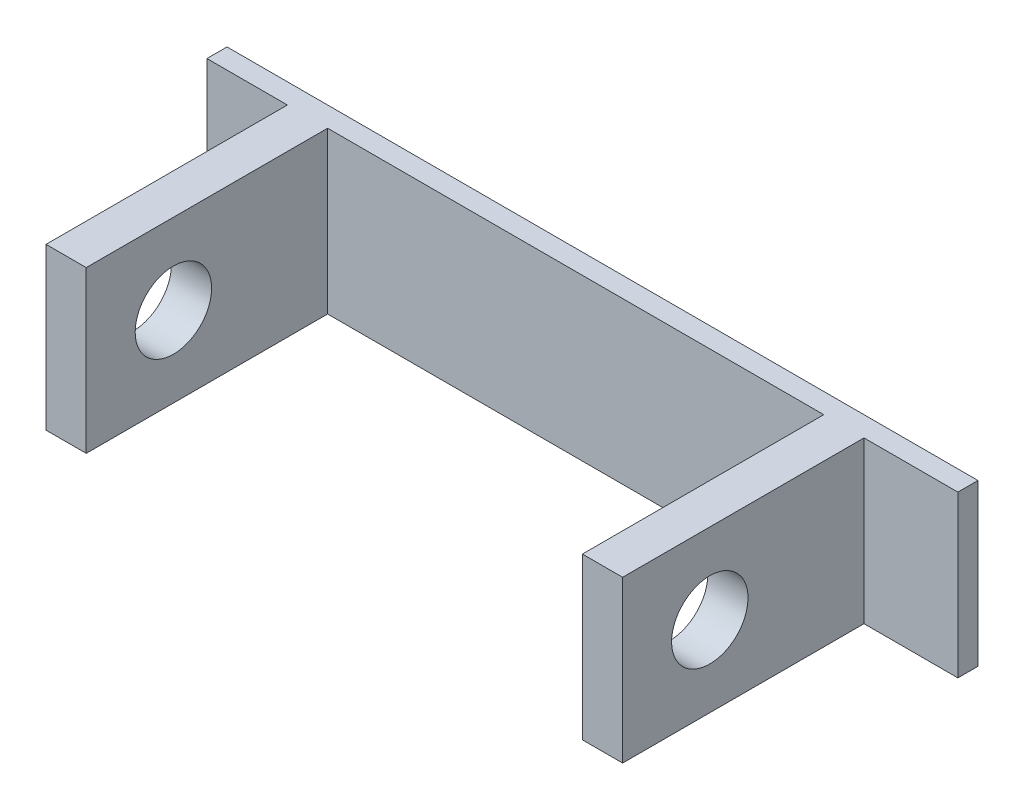
ISO-10303-21;
HEADER;
FILE_DESCRIPTION(('STEP AP214'),'2;1');
FILE_NAME('part.step','',(''),(''),'','','');
FILE_SCHEMA(('AUTOMOTIVE_DESIGN { 1 0 10303 214 1 1 1 1 }'));
ENDSEC;
DATA;
#1=APPLICATION_CONTEXT('core data for automotive mechanical design processes');
#2=APPLICATION_PROTOCOL_DEFINITION('international standard','automotive_design',2000,#1);
#3=PRODUCT_CONTEXT('',#1,'mechanical');
#4=PRODUCT('Part','Part','',(#3));
#5=PRODUCT_RELATED_PRODUCT_CATEGORY('part','',(#4));
#6=PRODUCT_DEFINITION_FORMATION('','',#4);
#7=PRODUCT_DEFINITION_CONTEXT('part definition',#1,'design');
#8=PRODUCT_DEFINITION('design','',#6,#7);
#9=PRODUCT_DEFINITION_SHAPE('','',#8);
#10=(LENGTH_UNIT() NAMED_UNIT(*) SI_UNIT(.MILLI.,.METRE.));
#11=(NAMED_UNIT(*) PLANE_ANGLE_UNIT() SI_UNIT($,.RADIAN.));
#12=(NAMED_UNIT(*) SI_UNIT($,.STERADIAN.) SOLID_ANGLE_UNIT());
#13=UNCERTAINTY_MEASURE_WITH_UNIT(LENGTH_MEASURE(1.E-05),#10,'distance_accuracy_value','');
#14=(GEOMETRIC_REPRESENTATION_CONTEXT(3) GLOBAL_UNCERTAINTY_ASSIGNED_CONTEXT((#13)) GLOBAL_UNIT_ASSIGNED_CONTEXT((#10,
#11,#12)) REPRESENTATION_CONTEXT('',''));
#15=CARTESIAN_POINT('',(0.,0.,0.));
#16=DIRECTION('',(0.,0.,1.));
#17=DIRECTION('',(1.,0.,0.));
#18=AXIS2_PLACEMENT_3D('',#15,#16,#17);
#19=CARTESIAN_POINT('',(0.,0.,1.5));
#20=DIRECTION('',(0.,0.,1.));
#21=DIRECTION('',(1.,0.,0.));
#22=AXIS2_PLACEMENT_3D('',#19,#20,#21);
#23=PLANE('',#22);
#24=DIRECTION('',(1.,0.,0.));
#25=VECTOR('',#24,1.);
#26=CARTESIAN_POINT('',(-28.,-6.,1.5));
#27=LINE('',#26,#25);
#28=CARTESIAN_POINT('',(-19.,-6.,1.5));
#29=VERTEX_POINT('',#28);
#30=CARTESIAN_POINT('',(18.,-6.,1.5));
#31=VERTEX_POINT('',#30);
#32=EDGE_CURVE('E190',#29,#31,#27,.T.);
#33=ORIENTED_EDGE('',*,*,#32,.T.);
#34=DIRECTION('',(0.,-1.,0.));
#35=VECTOR('',#34,1.);
#36=CARTESIAN_POINT('',(18.,6.,1.5));
#37=LINE('',#36,#35);
#38=CARTESIAN_POINT('',(18.,6.,1.5));
#39=VERTEX_POINT('',#38);
#40=EDGE_CURVE('E144',#39,#31,#37,.T.);
#41=ORIENTED_EDGE('',*,*,#40,.F.);
#42=DIRECTION('',(-1.,0.,0.));
#43=VECTOR('',#42,1.);
#44=CARTESIAN_POINT('',(-28.,6.,1.5));
#45=LINE('',#44,#43);
#46=CARTESIAN_POINT('',(-19.,6.,1.5));
#47=VERTEX_POINT('',#46);
#48=EDGE_CURVE('E184',#39,#47,#45,.T.);
#49=ORIENTED_EDGE('',*,*,#48,.T.);
#50=DIRECTION('',(0.,1.,0.));
#51=VECTOR('',#50,1.);
#52=CARTESIAN_POINT('',(-19.,6.,1.5));
#53=LINE('',#52,#51);
#54=EDGE_CURVE('E148',#29,#47,#53,.T.);
#55=ORIENTED_EDGE('',*,*,#54,.F.);
#56=EDGE_LOOP('',(#33,#41,#49,#55));
#57=FACE_BOUND('',#56,.T.);
#58=ADVANCED_FACE('F33',(#57),#23,.T.);
#59=CARTESIAN_POINT('',(28.,6.,1.5));
#60=VERTEX_POINT('',#59);
#61=CARTESIAN_POINT('',(21.,6.,1.5));
#62=VERTEX_POINT('',#61);
#63=EDGE_CURVE('E48',#60,#62,#45,.T.);
#64=ORIENTED_EDGE('',*,*,#63,.T.);
#65=DIRECTION('',(0.,1.,0.));
#66=VECTOR('',#65,1.);
#67=CARTESIAN_POINT('',(21.,6.,1.5));
#68=LINE('',#67,#66);
#69=CARTESIAN_POINT('',(21.,-6.,1.5));
#70=VERTEX_POINT('',#69);
#71=EDGE_CURVE('E52',#70,#62,#68,.T.);
#72=ORIENTED_EDGE('',*,*,#71,.F.);
#73=CARTESIAN_POINT('',(28.,-6.,1.5));
#74=VERTEX_POINT('',#73);
#75=EDGE_CURVE('E186',#70,#74,#27,.T.);
#76=ORIENTED_EDGE('',*,*,#75,.T.);
#77=DIRECTION('',(0.,1.,0.));
#78=VECTOR('',#77,1.);
#79=CARTESIAN_POINT('',(28.,6.,1.5));
#80=LINE('',#79,#78);
#81=EDGE_CURVE('E178',#74,#60,#80,.T.);
#82=ORIENTED_EDGE('',*,*,#81,.T.);
#83=EDGE_LOOP('',(#64,#72,#76,#82));
#84=FACE_BOUND('',#83,.T.);
#85=ADVANCED_FACE('F220',(#84),#23,.T.);
#86=DIRECTION('',(0.,-1.,0.));
#87=VECTOR('',#86,1.);
#88=CARTESIAN_POINT('',(-22.,6.,1.5));
#89=LINE('',#88,#87);
#90=CARTESIAN_POINT('',(-22.,6.,1.5));
#91=VERTEX_POINT('',#90);
#92=CARTESIAN_POINT('',(-22.,-6.,1.5));
#93=VERTEX_POINT('',#92);
#94=EDGE_CURVE('E145',#91,#93,#89,.T.);
#95=ORIENTED_EDGE('',*,*,#94,.F.);
#96=CARTESIAN_POINT('',(-28.,6.,1.5));
#97=VERTEX_POINT('',#96);
#98=EDGE_CURVE('E180',#91,#97,#45,.T.);
#99=ORIENTED_EDGE('',*,*,#98,.T.);
#100=DIRECTION('',(0.,-1.,0.));
#101=VECTOR('',#100,1.);
#102=CARTESIAN_POINT('',(-28.,6.,1.5));
#103=LINE('',#102,#101);
#104=CARTESIAN_POINT('',(-28.,-6.,1.5));
#105=VERTEX_POINT('',#104);
#106=EDGE_CURVE('E183',#97,#105,#103,.T.);
#107=ORIENTED_EDGE('',*,*,#106,.T.);
#108=EDGE_CURVE('E187',#105,#93,#27,.T.);
#109=ORIENTED_EDGE('',*,*,#108,.T.);
#110=EDGE_LOOP('',(#95,#99,#107,#109));
#111=FACE_BOUND('',#110,.T.);
#112=ADVANCED_FACE('F236',(#111),#23,.T.);
#113=CARTESIAN_POINT('',(28.,6.,1.5));
#114=DIRECTION('',(-1.,0.,0.));
#115=DIRECTION('',(0.,-1.,0.));
#116=AXIS2_PLACEMENT_3D('',#113,#114,#115);
#117=PLANE('',#116);
#118=DIRECTION('',(0.,1.,0.));
#119=VECTOR('',#118,1.);
#120=CARTESIAN_POINT('',(28.,6.,0.));
#121=LINE('',#120,#119);
#122=CARTESIAN_POINT('',(28.,-6.,0.));
#123=VERTEX_POINT('',#122);
#124=CARTESIAN_POINT('',(28.,6.,0.));
#125=VERTEX_POINT('',#124);
#126=EDGE_CURVE('E177',#123,#125,#121,.T.);
#127=ORIENTED_EDGE('',*,*,#126,.T.);
#128=DIRECTION('',(0.,0.,-1.));
#129=VECTOR('',#128,1.);
#130=CARTESIAN_POINT('',(28.,6.,1.5));
#131=LINE('',#130,#129);
#132=EDGE_CURVE('E11',#60,#125,#131,.T.);
#133=ORIENTED_EDGE('',*,*,#132,.F.);
#134=ORIENTED_EDGE('',*,*,#81,.F.);
#135=DIRECTION('',(0.,0.,-1.));
#136=VECTOR('',#135,1.);
#137=CARTESIAN_POINT('',(28.,-6.,1.5));
#138=LINE('',#137,#136);
#139=EDGE_CURVE('E189',#74,#123,#138,.T.);
#140=ORIENTED_EDGE('',*,*,#139,.T.);
#141=EDGE_LOOP('',(#127,#133,#134,#140));
#142=FACE_BOUND('',#141,.T.);
#143=ADVANCED_FACE('F35',(#142),#117,.F.);
#144=CARTESIAN_POINT('',(-28.,6.,1.5));
#145=DIRECTION('',(0.,-1.,0.));
#146=DIRECTION('',(0.,0.,-1.));
#147=AXIS2_PLACEMENT_3D('',#144,#145,#146);
#148=PLANE('',#147);
#149=DIRECTION('',(-1.,0.,0.));
#150=VECTOR('',#149,1.);
#151=CARTESIAN_POINT('',(-28.,6.,0.));
#152=LINE('',#151,#150);
#153=CARTESIAN_POINT('',(-28.,6.,0.));
#154=VERTEX_POINT('',#153);
#155=EDGE_CURVE('E193',#125,#154,#152,.T.);
#156=ORIENTED_EDGE('',*,*,#155,.T.);
#157=DIRECTION('',(0.,0.,-1.));
#158=VECTOR('',#157,1.);
#159=CARTESIAN_POINT('',(-28.,6.,1.5));
#160=LINE('',#159,#158);
#161=EDGE_CURVE('E41',#97,#154,#160,.T.);
#162=ORIENTED_EDGE('',*,*,#161,.F.);
#163=ORIENTED_EDGE('',*,*,#98,.F.);
#164=DIRECTION('',(0.,0.,-1.));
#165=VECTOR('',#164,1.);
#166=CARTESIAN_POINT('',(-22.,6.,19.5));
#167=LINE('',#166,#165);
#168=CARTESIAN_POINT('',(-22.,6.,19.5));
#169=VERTEX_POINT('',#168);
#170=EDGE_CURVE('E162',#169,#91,#167,.T.);
#171=ORIENTED_EDGE('',*,*,#170,.F.);
#172=DIRECTION('',(-1.,0.,0.));
#173=VECTOR('',#172,1.);
#174=CARTESIAN_POINT('',(-22.,6.,19.5));
#175=LINE('',#174,#173);
#176=CARTESIAN_POINT('',(-19.,6.,19.5));
#177=VERTEX_POINT('',#176);
#178=EDGE_CURVE('E161',#177,#169,#175,.T.);
#179=ORIENTED_EDGE('',*,*,#178,.F.);
#180=DIRECTION('',(0.,0.,-1.));
#181=VECTOR('',#180,1.);
#182=CARTESIAN_POINT('',(-19.,6.,19.5));
#183=LINE('',#182,#181);
#184=EDGE_CURVE('E168',#177,#47,#183,.T.);
#185=ORIENTED_EDGE('',*,*,#184,.T.);
#186=ORIENTED_EDGE('',*,*,#48,.F.);
#187=DIRECTION('',(0.,0.,-1.));
#188=VECTOR('',#187,1.);
#189=CARTESIAN_POINT('',(18.,6.,19.5));
#190=LINE('',#189,#188);
#191=CARTESIAN_POINT('',(18.,6.,19.5));
#192=VERTEX_POINT('',#191);
#193=EDGE_CURVE('E238',#192,#39,#190,.T.);
#194=ORIENTED_EDGE('',*,*,#193,.F.);
#195=DIRECTION('',(-1.,0.,0.));
#196=VECTOR('',#195,1.);
#197=CARTESIAN_POINT('',(18.,6.,19.5));
#198=LINE('',#197,#196);
#199=CARTESIAN_POINT('',(21.,6.,19.5));
#200=VERTEX_POINT('',#199);
#201=EDGE_CURVE('E137',#200,#192,#198,.T.);
#202=ORIENTED_EDGE('',*,*,#201,.F.);
#203=DIRECTION('',(0.,0.,-1.));
#204=VECTOR('',#203,1.);
#205=CARTESIAN_POINT('',(21.,6.,19.5));
#206=LINE('',#205,#204);
#207=EDGE_CURVE('E150',#200,#62,#206,.T.);
#208=ORIENTED_EDGE('',*,*,#207,.T.);
#209=ORIENTED_EDGE('',*,*,#63,.F.);
#210=ORIENTED_EDGE('',*,*,#132,.T.);
#211=EDGE_LOOP('',(#156,#162,#163,#171,#179,#185,#186,#194,#202,#208,#209,#210));
#212=FACE_BOUND('',#211,.T.);
#213=ADVANCED_FACE('F237',(#212),#148,.F.);
#214=CARTESIAN_POINT('',(-28.,6.,1.5));
#215=DIRECTION('',(1.,0.,0.));
#216=DIRECTION('',(0.,0.,-1.));
#217=AXIS2_PLACEMENT_3D('',#214,#215,#216);
#218=PLANE('',#217);
#219=DIRECTION('',(0.,-1.,0.));
#220=VECTOR('',#219,1.);
#221=CARTESIAN_POINT('',(-28.,6.,0.));
#222=LINE('',#221,#220);
#223=CARTESIAN_POINT('',(-28.,-6.,0.));
#224=VERTEX_POINT('',#223);
#225=EDGE_CURVE('E195',#154,#224,#222,.T.);
#226=ORIENTED_EDGE('',*,*,#225,.T.);
#227=DIRECTION('',(0.,0.,-1.));
#228=VECTOR('',#227,1.);
#229=CARTESIAN_POINT('',(-28.,-6.,1.5));
#230=LINE('',#229,#228);
#231=EDGE_CURVE('E200',#105,#224,#230,.T.);
#232=ORIENTED_EDGE('',*,*,#231,.F.);
#233=ORIENTED_EDGE('',*,*,#106,.F.);
#234=ORIENTED_EDGE('',*,*,#161,.T.);
#235=EDGE_LOOP('',(#226,#232,#233,#234));
#236=FACE_BOUND('',#235,.T.);
#237=ADVANCED_FACE('F207',(#236),#218,.F.);
#238=CARTESIAN_POINT('',(-28.,-6.,1.5));
#239=DIRECTION('',(0.,1.,0.));
#240=DIRECTION('',(0.,0.,1.));
#241=AXIS2_PLACEMENT_3D('',#238,#239,#240);
#242=PLANE('',#241);
#243=DIRECTION('',(1.,0.,0.));
#244=VECTOR('',#243,1.);
#245=CARTESIAN_POINT('',(-28.,-6.,0.));
#246=LINE('',#245,#244);
#247=EDGE_CURVE('E181',#224,#123,#246,.T.);
#248=ORIENTED_EDGE('',*,*,#247,.T.);
#249=ORIENTED_EDGE('',*,*,#139,.F.);
#250=ORIENTED_EDGE('',*,*,#75,.F.);
#251=DIRECTION('',(0.,0.,-1.));
#252=VECTOR('',#251,1.);
#253=CARTESIAN_POINT('',(21.,-6.,19.5));
#254=LINE('',#253,#252);
#255=CARTESIAN_POINT('',(21.,-6.,19.5));
#256=VERTEX_POINT('',#255);
#257=EDGE_CURVE('E128',#256,#70,#254,.T.);
#258=ORIENTED_EDGE('',*,*,#257,.F.);
#259=DIRECTION('',(1.,0.,0.));
#260=VECTOR('',#259,1.);
#261=CARTESIAN_POINT('',(18.,-6.,19.5));
#262=LINE('',#261,#260);
#263=CARTESIAN_POINT('',(18.,-6.,19.5));
#264=VERTEX_POINT('',#263);
#265=EDGE_CURVE('E120',#264,#256,#262,.T.);
#266=ORIENTED_EDGE('',*,*,#265,.F.);
#267=DIRECTION('',(0.,0.,-1.));
#268=VECTOR('',#267,1.);
#269=CARTESIAN_POINT('',(18.,-6.,19.5));
#270=LINE('',#269,#268);
#271=EDGE_CURVE('E125',#264,#31,#270,.T.);
#272=ORIENTED_EDGE('',*,*,#271,.T.);
#273=ORIENTED_EDGE('',*,*,#32,.F.);
#274=DIRECTION('',(0.,0.,-1.));
#275=VECTOR('',#274,1.);
#276=CARTESIAN_POINT('',(-19.,-6.,19.5));
#277=LINE('',#276,#275);
#278=CARTESIAN_POINT('',(-19.,-6.,19.5));
#279=VERTEX_POINT('',#278);
#280=EDGE_CURVE('E171',#279,#29,#277,.T.);
#281=ORIENTED_EDGE('',*,*,#280,.F.);
#282=DIRECTION('',(1.,0.,0.));
#283=VECTOR('',#282,1.);
#284=CARTESIAN_POINT('',(-22.,-6.,19.5));
#285=LINE('',#284,#283);
#286=CARTESIAN_POINT('',(-22.,-6.,19.5));
#287=VERTEX_POINT('',#286);
#288=EDGE_CURVE('E157',#287,#279,#285,.T.);
#289=ORIENTED_EDGE('',*,*,#288,.F.);
#290=DIRECTION('',(0.,0.,-1.));
#291=VECTOR('',#290,1.);
#292=CARTESIAN_POINT('',(-22.,-6.,19.5));
#293=LINE('',#292,#291);
#294=EDGE_CURVE('E174',#287,#93,#293,.T.);
#295=ORIENTED_EDGE('',*,*,#294,.T.);
#296=ORIENTED_EDGE('',*,*,#108,.F.);
#297=ORIENTED_EDGE('',*,*,#231,.T.);
#298=EDGE_LOOP('',(#248,#249,#250,#258,#266,#272,#273,#281,#289,#295,#296,#297));
#299=FACE_BOUND('',#298,.T.);
#300=ADVANCED_FACE('F122',(#299),#242,.F.);
#301=CARTESIAN_POINT('',(0.,0.,0.));
#302=DIRECTION('',(0.,0.,1.));
#303=DIRECTION('',(1.,0.,0.));
#304=AXIS2_PLACEMENT_3D('',#301,#302,#303);
#305=PLANE('',#304);
#306=ORIENTED_EDGE('',*,*,#126,.F.);
#307=ORIENTED_EDGE('',*,*,#247,.F.);
#308=ORIENTED_EDGE('',*,*,#225,.F.);
#309=ORIENTED_EDGE('',*,*,#155,.F.);
#310=EDGE_LOOP('',(#306,#307,#308,#309));
#311=FACE_BOUND('',#310,.T.);
#312=ADVANCED_FACE('F214',(#311),#305,.F.);
#313=CARTESIAN_POINT('',(-22.,6.,19.5));
#314=DIRECTION('',(1.,0.,0.));
#315=DIRECTION('',(0.,1.,0.));
#316=AXIS2_PLACEMENT_3D('',#313,#314,#315);
#317=PLANE('',#316);
#318=CARTESIAN_POINT('',(-22.,0.,13.));
#319=DIRECTION('',(1.,0.,0.));
#320=DIRECTION('',(0.,1.,0.));
#321=AXIS2_PLACEMENT_3D('',#318,#319,#320);
#322=CIRCLE('',#321,2.85);
#323=CARTESIAN_POINT('',(-22.,2.85000000000001,13.));
#324=VERTEX_POINT('',#323);
#325=EDGE_CURVE('E244',#324,#324,#322,.T.);
#326=ORIENTED_EDGE('',*,*,#325,.T.);
#327=EDGE_LOOP('',(#326));
#328=FACE_BOUND('',#327,.T.);
#329=ORIENTED_EDGE('',*,*,#94,.T.);
#330=ORIENTED_EDGE('',*,*,#294,.F.);
#331=DIRECTION('',(0.,-1.,0.));
#332=VECTOR('',#331,1.);
#333=CARTESIAN_POINT('',(-22.,6.,19.5));
#334=LINE('',#333,#332);
#335=EDGE_CURVE('E154',#169,#287,#334,.T.);
#336=ORIENTED_EDGE('',*,*,#335,.F.);
#337=ORIENTED_EDGE('',*,*,#170,.T.);
#338=EDGE_LOOP('',(#329,#330,#336,#337));
#339=FACE_BOUND('',#338,.T.);
#340=ADVANCED_FACE('F234',(#328,#339),#317,.F.);
#341=CARTESIAN_POINT('',(-19.,6.,19.5));
#342=DIRECTION('',(-1.,0.,0.));
#343=DIRECTION('',(0.,0.,1.));
#344=AXIS2_PLACEMENT_3D('',#341,#342,#343);
#345=PLANE('',#344);
#346=CARTESIAN_POINT('',(-19.,0.,13.));
#347=DIRECTION('',(-1.,0.,0.));
#348=DIRECTION('',(0.,0.,1.));
#349=AXIS2_PLACEMENT_3D('',#346,#347,#348);
#350=CIRCLE('',#349,2.85);
#351=CARTESIAN_POINT('',(-19.,0.,15.85));
#352=VERTEX_POINT('',#351);
#353=EDGE_CURVE('E249',#352,#352,#350,.T.);
#354=ORIENTED_EDGE('',*,*,#353,.T.);
#355=EDGE_LOOP('',(#354));
#356=FACE_BOUND('',#355,.T.);
#357=ORIENTED_EDGE('',*,*,#54,.T.);
#358=ORIENTED_EDGE('',*,*,#184,.F.);
#359=DIRECTION('',(0.,1.,0.));
#360=VECTOR('',#359,1.);
#361=CARTESIAN_POINT('',(-19.,6.,19.5));
#362=LINE('',#361,#360);
#363=EDGE_CURVE('E159',#279,#177,#362,.T.);
#364=ORIENTED_EDGE('',*,*,#363,.F.);
#365=ORIENTED_EDGE('',*,*,#280,.T.);
#366=EDGE_LOOP('',(#357,#358,#364,#365));
#367=FACE_BOUND('',#366,.T.);
#368=ADVANCED_FACE('F225',(#356,#367),#345,.F.);
#369=CARTESIAN_POINT('',(0.,0.,19.5));
#370=DIRECTION('',(0.,0.,1.));
#371=DIRECTION('',(1.,0.,0.));
#372=AXIS2_PLACEMENT_3D('',#369,#370,#371);
#373=PLANE('',#372);
#374=ORIENTED_EDGE('',*,*,#335,.T.);
#375=ORIENTED_EDGE('',*,*,#288,.T.);
#376=ORIENTED_EDGE('',*,*,#363,.T.);
#377=ORIENTED_EDGE('',*,*,#178,.T.);
#378=EDGE_LOOP('',(#374,#375,#376,#377));
#379=FACE_BOUND('',#378,.T.);
#380=ADVANCED_FACE('F229',(#379),#373,.T.);
#381=CARTESIAN_POINT('',(18.,6.,19.5));
#382=DIRECTION('',(1.,0.,0.));
#383=DIRECTION('',(0.,0.,-1.));
#384=AXIS2_PLACEMENT_3D('',#381,#382,#383);
#385=PLANE('',#384);
#386=CARTESIAN_POINT('',(18.,0.,13.));
#387=DIRECTION('',(1.,0.,0.));
#388=DIRECTION('',(0.,0.,-1.));
#389=AXIS2_PLACEMENT_3D('',#386,#387,#388);
#390=CIRCLE('',#389,2.85);
#391=CARTESIAN_POINT('',(18.,0.,10.15));
#392=VERTEX_POINT('',#391);
#393=EDGE_CURVE('E252',#392,#392,#390,.T.);
#394=ORIENTED_EDGE('',*,*,#393,.T.);
#395=EDGE_LOOP('',(#394));
#396=FACE_BOUND('',#395,.T.);
#397=ORIENTED_EDGE('',*,*,#40,.T.);
#398=ORIENTED_EDGE('',*,*,#271,.F.);
#399=DIRECTION('',(0.,-1.,0.));
#400=VECTOR('',#399,1.);
#401=CARTESIAN_POINT('',(18.,6.,19.5));
#402=LINE('',#401,#400);
#403=EDGE_CURVE('E132',#192,#264,#402,.T.);
#404=ORIENTED_EDGE('',*,*,#403,.F.);
#405=ORIENTED_EDGE('',*,*,#193,.T.);
#406=EDGE_LOOP('',(#397,#398,#404,#405));
#407=FACE_BOUND('',#406,.T.);
#408=ADVANCED_FACE('F142',(#396,#407),#385,.F.);
#409=CARTESIAN_POINT('',(21.,6.,19.5));
#410=DIRECTION('',(-1.,0.,0.));
#411=DIRECTION('',(0.,-1.,0.));
#412=AXIS2_PLACEMENT_3D('',#409,#410,#411);
#413=PLANE('',#412);
#414=CARTESIAN_POINT('',(21.,0.,13.));
#415=DIRECTION('',(1.,0.,0.));
#416=DIRECTION('',(0.,1.,0.));
#417=AXIS2_PLACEMENT_3D('',#414,#415,#416);
#418=CIRCLE('',#417,2.85);
#419=CARTESIAN_POINT('',(21.,2.84999999999999,13.));
#420=VERTEX_POINT('',#419);
#421=EDGE_CURVE('E255',#420,#420,#418,.T.);
#422=ORIENTED_EDGE('',*,*,#421,.F.);
#423=EDGE_LOOP('',(#422));
#424=FACE_BOUND('',#423,.T.);
#425=ORIENTED_EDGE('',*,*,#71,.T.);
#426=ORIENTED_EDGE('',*,*,#207,.F.);
#427=DIRECTION('',(0.,1.,0.));
#428=VECTOR('',#427,1.);
#429=CARTESIAN_POINT('',(21.,6.,19.5));
#430=LINE('',#429,#428);
#431=EDGE_CURVE('E131',#256,#200,#430,.T.);
#432=ORIENTED_EDGE('',*,*,#431,.F.);
#433=ORIENTED_EDGE('',*,*,#257,.T.);
#434=EDGE_LOOP('',(#425,#426,#432,#433));
#435=FACE_BOUND('',#434,.T.);
#436=ADVANCED_FACE('F262',(#424,#435),#413,.F.);
#437=CARTESIAN_POINT('',(0.,0.,19.5));
#438=DIRECTION('',(0.,0.,1.));
#439=DIRECTION('',(1.,0.,0.));
#440=AXIS2_PLACEMENT_3D('',#437,#438,#439);
#441=PLANE('',#440);
#442=ORIENTED_EDGE('',*,*,#403,.T.);
#443=ORIENTED_EDGE('',*,*,#265,.T.);
#444=ORIENTED_EDGE('',*,*,#431,.T.);
#445=ORIENTED_EDGE('',*,*,#201,.T.);
#446=EDGE_LOOP('',(#442,#443,#444,#445));
#447=FACE_BOUND('',#446,.T.);
#448=ADVANCED_FACE('F135',(#447),#441,.T.);
#449=CARTESIAN_POINT('',(-28.,0.,13.));
#450=DIRECTION('',(1.,0.,0.));
#451=DIRECTION('',(0.,1.,0.));
#452=AXIS2_PLACEMENT_3D('',#449,#450,#451);
#453=CYLINDRICAL_SURFACE('',#452,2.85);
#454=ORIENTED_EDGE('',*,*,#421,.T.);
#455=EDGE_LOOP('',(#454));
#456=FACE_BOUND('',#455,.T.);
#457=ORIENTED_EDGE('',*,*,#393,.F.);
#458=EDGE_LOOP('',(#457));
#459=FACE_BOUND('',#458,.T.);
#460=ADVANCED_FACE('F259',(#456,#459),#453,.F.);
#461=ORIENTED_EDGE('',*,*,#353,.F.);
#462=EDGE_LOOP('',(#461));
#463=FACE_BOUND('',#462,.T.);
#464=ORIENTED_EDGE('',*,*,#325,.F.);
#465=EDGE_LOOP('',(#464));
#466=FACE_BOUND('',#465,.T.);
#467=ADVANCED_FACE('F334',(#463,#466),#453,.F.);
#468=CLOSED_SHELL('',(#58,#85,#112,#143,#213,#237,#300,#312,#340,#368,#380,#408,#436,#448,#460,#467));
#469=MANIFOLD_SOLID_BREP('B2',#468);
#470=ADVANCED_BREP_SHAPE_REPRESENTATION('',(#18,#469),#14);
#471=SHAPE_DEFINITION_REPRESENTATION(#9,#470);
ENDSEC;
END-ISO-10303-21;
